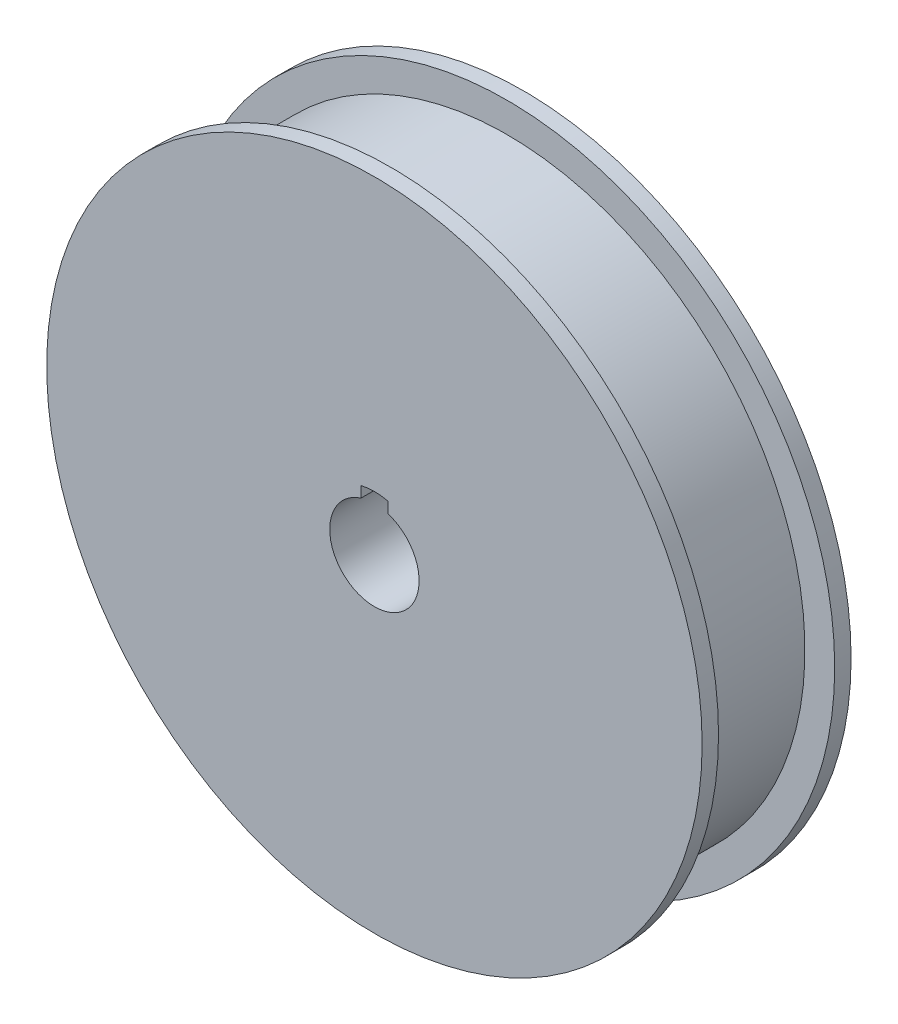
ISO-10303-21;
HEADER;
FILE_DESCRIPTION(('STEP AP214'),'2;1');
FILE_NAME('part.step','',(''),(''),'','','');
FILE_SCHEMA(('AUTOMOTIVE_DESIGN { 1 0 10303 214 1 1 1 1 }'));
ENDSEC;
DATA;
#1=APPLICATION_CONTEXT('core data for automotive mechanical design processes');
#2=APPLICATION_PROTOCOL_DEFINITION('international standard','automotive_design',2000,#1);
#3=PRODUCT_CONTEXT('',#1,'mechanical');
#4=PRODUCT('Part','Part','',(#3));
#5=PRODUCT_RELATED_PRODUCT_CATEGORY('part','',(#4));
#6=PRODUCT_DEFINITION_FORMATION('','',#4);
#7=PRODUCT_DEFINITION_CONTEXT('part definition',#1,'design');
#8=PRODUCT_DEFINITION('design','',#6,#7);
#9=PRODUCT_DEFINITION_SHAPE('','',#8);
#10=(LENGTH_UNIT() NAMED_UNIT(*) SI_UNIT(.MILLI.,.METRE.));
#11=(NAMED_UNIT(*) PLANE_ANGLE_UNIT() SI_UNIT($,.RADIAN.));
#12=(NAMED_UNIT(*) SI_UNIT($,.STERADIAN.) SOLID_ANGLE_UNIT());
#13=UNCERTAINTY_MEASURE_WITH_UNIT(LENGTH_MEASURE(1.E-05),#10,'distance_accuracy_value','');
#14=(GEOMETRIC_REPRESENTATION_CONTEXT(3) GLOBAL_UNCERTAINTY_ASSIGNED_CONTEXT((#13)) GLOBAL_UNIT_ASSIGNED_CONTEXT((#10,
#11,#12)) REPRESENTATION_CONTEXT('',''));
#15=CARTESIAN_POINT('',(0.,0.,0.));
#16=DIRECTION('',(0.,0.,1.));
#17=DIRECTION('',(1.,0.,0.));
#18=AXIS2_PLACEMENT_3D('',#15,#16,#17);
#19=CARTESIAN_POINT('',(0.,0.,50.));
#20=DIRECTION('',(0.,0.,-1.));
#21=DIRECTION('',(-1.,0.,0.));
#22=AXIS2_PLACEMENT_3D('',#19,#20,#21);
#23=CYLINDRICAL_SURFACE('',#22,200.);
#24=CARTESIAN_POINT('',(0.,0.,39.));
#25=DIRECTION('',(0.,0.,1.));
#26=DIRECTION('',(1.,0.,0.));
#27=AXIS2_PLACEMENT_3D('',#24,#25,#26);
#28=CIRCLE('',#27,200.);
#29=CARTESIAN_POINT('',(200.,0.,39.));
#30=VERTEX_POINT('',#29);
#31=EDGE_CURVE('E110',#30,#30,#28,.T.);
#32=ORIENTED_EDGE('',*,*,#31,.F.);
#33=EDGE_LOOP('',(#32));
#34=FACE_BOUND('',#33,.T.);
#35=CARTESIAN_POINT('',(0.,0.,-39.));
#36=DIRECTION('',(0.,0.,-1.));
#37=DIRECTION('',(-1.,0.,0.));
#38=AXIS2_PLACEMENT_3D('',#35,#36,#37);
#39=CIRCLE('',#38,200.);
#40=CARTESIAN_POINT('',(-200.,0.,-39.));
#41=VERTEX_POINT('',#40);
#42=EDGE_CURVE('E107',#41,#41,#39,.T.);
#43=ORIENTED_EDGE('',*,*,#42,.F.);
#44=EDGE_LOOP('',(#43));
#45=FACE_BOUND('',#44,.T.);
#46=ADVANCED_FACE('F33',(#34,#45),#23,.T.);
#47=CARTESIAN_POINT('',(0.,0.,50.));
#48=DIRECTION('',(0.,0.,1.));
#49=DIRECTION('',(1.,0.,0.));
#50=AXIS2_PLACEMENT_3D('',#47,#48,#49);
#51=PLANE('',#50);
#52=DIRECTION('',(0.,-1.,0.));
#53=VECTOR('',#52,1.);
#54=CARTESIAN_POINT('',(-9.,19.4566110905982,50.));
#55=LINE('',#54,#53);
#56=CARTESIAN_POINT('',(-9.,35.8887168898527,50.));
#57=VERTEX_POINT('',#56);
#58=CARTESIAN_POINT('',(-9.,28.6181760425084,50.));
#59=VERTEX_POINT('',#58);
#60=EDGE_CURVE('E91',#57,#59,#55,.T.);
#61=ORIENTED_EDGE('',*,*,#60,.F.);
#62=CARTESIAN_POINT('',(0.,0.,50.));
#63=DIRECTION('',(0.,0.,1.));
#64=DIRECTION('',(1.,0.,0.));
#65=AXIS2_PLACEMENT_3D('',#62,#63,#64);
#66=CIRCLE('',#65,37.);
#67=CARTESIAN_POINT('',(9.,35.8887168898527,50.));
#68=VERTEX_POINT('',#67);
#69=EDGE_CURVE('E93',#68,#57,#66,.T.);
#70=ORIENTED_EDGE('',*,*,#69,.F.);
#71=DIRECTION('',(0.,1.,0.));
#72=VECTOR('',#71,1.);
#73=CARTESIAN_POINT('',(9.,19.4566110905982,50.));
#74=LINE('',#73,#72);
#75=CARTESIAN_POINT('',(9.,28.6181760425084,50.));
#76=VERTEX_POINT('',#75);
#77=EDGE_CURVE('E74',#76,#68,#74,.T.);
#78=ORIENTED_EDGE('',*,*,#77,.F.);
#79=CARTESIAN_POINT('',(0.,0.,50.));
#80=DIRECTION('',(0.,0.,1.));
#81=DIRECTION('',(1.,0.,0.));
#82=AXIS2_PLACEMENT_3D('',#79,#80,#81);
#83=CIRCLE('',#82,30.);
#84=EDGE_CURVE('E118',#59,#76,#83,.T.);
#85=ORIENTED_EDGE('',*,*,#84,.F.);
#86=EDGE_LOOP('',(#61,#70,#78,#85));
#87=FACE_BOUND('',#86,.T.);
#88=CARTESIAN_POINT('',(0.,0.,50.));
#89=DIRECTION('',(0.,0.,1.));
#90=DIRECTION('',(1.,0.,0.));
#91=AXIS2_PLACEMENT_3D('',#88,#89,#90);
#92=CIRCLE('',#91,220.);
#93=CARTESIAN_POINT('',(220.,0.,50.));
#94=VERTEX_POINT('',#93);
#95=EDGE_CURVE('E104',#94,#94,#92,.T.);
#96=ORIENTED_EDGE('',*,*,#95,.T.);
#97=EDGE_LOOP('',(#96));
#98=FACE_BOUND('',#97,.T.);
#99=ADVANCED_FACE('F125',(#87,#98),#51,.T.);
#100=CARTESIAN_POINT('',(0.,0.,-50.));
#101=DIRECTION('',(0.,0.,1.));
#102=DIRECTION('',(1.,0.,0.));
#103=AXIS2_PLACEMENT_3D('',#100,#101,#102);
#104=PLANE('',#103);
#105=CARTESIAN_POINT('',(0.,0.,-50.));
#106=DIRECTION('',(0.,0.,1.));
#107=DIRECTION('',(1.,0.,0.));
#108=AXIS2_PLACEMENT_3D('',#105,#106,#107);
#109=CIRCLE('',#108,37.);
#110=CARTESIAN_POINT('',(9.,35.8887168898527,-50.));
#111=VERTEX_POINT('',#110);
#112=CARTESIAN_POINT('',(-9.,35.8887168898527,-50.));
#113=VERTEX_POINT('',#112);
#114=EDGE_CURVE('E82',#111,#113,#109,.T.);
#115=ORIENTED_EDGE('',*,*,#114,.T.);
#116=DIRECTION('',(0.,-1.,0.));
#117=VECTOR('',#116,1.);
#118=CARTESIAN_POINT('',(-9.,19.4566110905982,-50.));
#119=LINE('',#118,#117);
#120=CARTESIAN_POINT('',(-9.,28.6181760425084,-50.));
#121=VERTEX_POINT('',#120);
#122=EDGE_CURVE('E79',#113,#121,#119,.T.);
#123=ORIENTED_EDGE('',*,*,#122,.T.);
#124=CARTESIAN_POINT('',(0.,0.,-50.));
#125=DIRECTION('',(0.,0.,1.));
#126=DIRECTION('',(1.,0.,0.));
#127=AXIS2_PLACEMENT_3D('',#124,#125,#126);
#128=CIRCLE('',#127,30.);
#129=CARTESIAN_POINT('',(9.,28.6181760425084,-50.));
#130=VERTEX_POINT('',#129);
#131=EDGE_CURVE('E90',#121,#130,#128,.T.);
#132=ORIENTED_EDGE('',*,*,#131,.T.);
#133=DIRECTION('',(0.,1.,0.));
#134=VECTOR('',#133,1.);
#135=CARTESIAN_POINT('',(9.,19.4566110905982,-50.));
#136=LINE('',#135,#134);
#137=EDGE_CURVE('E47',#130,#111,#136,.T.);
#138=ORIENTED_EDGE('',*,*,#137,.T.);
#139=EDGE_LOOP('',(#115,#123,#132,#138));
#140=FACE_BOUND('',#139,.T.);
#141=CARTESIAN_POINT('',(0.,0.,-50.));
#142=DIRECTION('',(0.,0.,1.));
#143=DIRECTION('',(1.,0.,0.));
#144=AXIS2_PLACEMENT_3D('',#141,#142,#143);
#145=CIRCLE('',#144,220.);
#146=CARTESIAN_POINT('',(220.,0.,-50.));
#147=VERTEX_POINT('',#146);
#148=EDGE_CURVE('E99',#147,#147,#145,.T.);
#149=ORIENTED_EDGE('',*,*,#148,.F.);
#150=EDGE_LOOP('',(#149));
#151=FACE_BOUND('',#150,.T.);
#152=ADVANCED_FACE('F87',(#140,#151),#104,.F.);
#153=CARTESIAN_POINT('',(0.,0.,50.));
#154=DIRECTION('',(0.,0.,-1.));
#155=DIRECTION('',(-1.,0.,0.));
#156=AXIS2_PLACEMENT_3D('',#153,#154,#155);
#157=CYLINDRICAL_SURFACE('',#156,30.);
#158=DIRECTION('',(0.,0.,-1.));
#159=VECTOR('',#158,1.);
#160=CARTESIAN_POINT('',(-9.,28.6181760425084,50.));
#161=LINE('',#160,#159);
#162=EDGE_CURVE('E11',#59,#121,#161,.T.);
#163=ORIENTED_EDGE('',*,*,#162,.F.);
#164=ORIENTED_EDGE('',*,*,#84,.T.);
#165=DIRECTION('',(0.,0.,-1.));
#166=VECTOR('',#165,1.);
#167=CARTESIAN_POINT('',(9.,28.6181760425084,50.));
#168=LINE('',#167,#166);
#169=EDGE_CURVE('E40',#130,#76,#168,.F.);
#170=ORIENTED_EDGE('',*,*,#169,.F.);
#171=ORIENTED_EDGE('',*,*,#131,.F.);
#172=EDGE_LOOP('',(#163,#164,#170,#171));
#173=FACE_BOUND('',#172,.T.);
#174=ADVANCED_FACE('F127',(#173),#157,.F.);
#175=CARTESIAN_POINT('',(0.,0.,39.));
#176=DIRECTION('',(0.,0.,1.));
#177=DIRECTION('',(1.,0.,0.));
#178=AXIS2_PLACEMENT_3D('',#175,#176,#177);
#179=PLANE('',#178);
#180=CARTESIAN_POINT('',(0.,0.,39.));
#181=DIRECTION('',(0.,0.,1.));
#182=DIRECTION('',(1.,0.,0.));
#183=AXIS2_PLACEMENT_3D('',#180,#181,#182);
#184=CIRCLE('',#183,220.);
#185=CARTESIAN_POINT('',(220.,0.,39.));
#186=VERTEX_POINT('',#185);
#187=EDGE_CURVE('E111',#186,#186,#184,.T.);
#188=ORIENTED_EDGE('',*,*,#187,.F.);
#189=EDGE_LOOP('',(#188));
#190=FACE_BOUND('',#189,.T.);
#191=ORIENTED_EDGE('',*,*,#31,.T.);
#192=EDGE_LOOP('',(#191));
#193=FACE_BOUND('',#192,.T.);
#194=ADVANCED_FACE('F129',(#190,#193),#179,.F.);
#195=CARTESIAN_POINT('',(0.,0.,39.));
#196=DIRECTION('',(0.,0.,1.));
#197=DIRECTION('',(1.,0.,0.));
#198=AXIS2_PLACEMENT_3D('',#195,#196,#197);
#199=CYLINDRICAL_SURFACE('',#198,220.);
#200=ORIENTED_EDGE('',*,*,#187,.T.);
#201=EDGE_LOOP('',(#200));
#202=FACE_BOUND('',#201,.T.);
#203=ORIENTED_EDGE('',*,*,#95,.F.);
#204=EDGE_LOOP('',(#203));
#205=FACE_BOUND('',#204,.T.);
#206=ADVANCED_FACE('F135',(#202,#205),#199,.T.);
#207=CARTESIAN_POINT('',(0.,0.,-39.));
#208=DIRECTION('',(0.,0.,-1.));
#209=DIRECTION('',(1.,0.,0.));
#210=AXIS2_PLACEMENT_3D('',#207,#208,#209);
#211=PLANE('',#210);
#212=CARTESIAN_POINT('',(0.,0.,-39.));
#213=DIRECTION('',(0.,0.,1.));
#214=DIRECTION('',(1.,0.,0.));
#215=AXIS2_PLACEMENT_3D('',#212,#213,#214);
#216=CIRCLE('',#215,220.);
#217=CARTESIAN_POINT('',(220.,0.,-39.));
#218=VERTEX_POINT('',#217);
#219=EDGE_CURVE('E101',#218,#218,#216,.T.);
#220=ORIENTED_EDGE('',*,*,#219,.T.);
#221=EDGE_LOOP('',(#220));
#222=FACE_BOUND('',#221,.T.);
#223=ORIENTED_EDGE('',*,*,#42,.T.);
#224=EDGE_LOOP('',(#223));
#225=FACE_BOUND('',#224,.T.);
#226=ADVANCED_FACE('F149',(#222,#225),#211,.F.);
#227=CARTESIAN_POINT('',(0.,0.,-39.));
#228=DIRECTION('',(0.,0.,-1.));
#229=DIRECTION('',(-1.,0.,0.));
#230=AXIS2_PLACEMENT_3D('',#227,#228,#229);
#231=CYLINDRICAL_SURFACE('',#230,220.);
#232=ORIENTED_EDGE('',*,*,#219,.F.);
#233=EDGE_LOOP('',(#232));
#234=FACE_BOUND('',#233,.T.);
#235=ORIENTED_EDGE('',*,*,#148,.T.);
#236=EDGE_LOOP('',(#235));
#237=FACE_BOUND('',#236,.T.);
#238=ADVANCED_FACE('F151',(#234,#237),#231,.T.);
#239=CARTESIAN_POINT('',(-9.,19.4566110905982,-50.));
#240=DIRECTION('',(-1.,0.,0.));
#241=DIRECTION('',(0.,-1.,0.));
#242=AXIS2_PLACEMENT_3D('',#239,#240,#241);
#243=PLANE('',#242);
#244=ORIENTED_EDGE('',*,*,#162,.T.);
#245=ORIENTED_EDGE('',*,*,#122,.F.);
#246=DIRECTION('',(0.,0.,1.));
#247=VECTOR('',#246,1.);
#248=CARTESIAN_POINT('',(-9.,35.8887168898527,-50.));
#249=LINE('',#248,#247);
#250=EDGE_CURVE('E78',#113,#57,#249,.T.);
#251=ORIENTED_EDGE('',*,*,#250,.T.);
#252=ORIENTED_EDGE('',*,*,#60,.T.);
#253=EDGE_LOOP('',(#244,#245,#251,#252));
#254=FACE_BOUND('',#253,.T.);
#255=ADVANCED_FACE('F158',(#254),#243,.F.);
#256=CARTESIAN_POINT('',(0.,0.,-50.));
#257=DIRECTION('',(0.,0.,1.));
#258=DIRECTION('',(1.,0.,0.));
#259=AXIS2_PLACEMENT_3D('',#256,#257,#258);
#260=CYLINDRICAL_SURFACE('',#259,37.);
#261=ORIENTED_EDGE('',*,*,#69,.T.);
#262=ORIENTED_EDGE('',*,*,#250,.F.);
#263=ORIENTED_EDGE('',*,*,#114,.F.);
#264=DIRECTION('',(0.,0.,1.));
#265=VECTOR('',#264,1.);
#266=CARTESIAN_POINT('',(9.,35.8887168898527,-50.));
#267=LINE('',#266,#265);
#268=EDGE_CURVE('E70',#111,#68,#267,.T.);
#269=ORIENTED_EDGE('',*,*,#268,.T.);
#270=EDGE_LOOP('',(#261,#262,#263,#269));
#271=FACE_BOUND('',#270,.T.);
#272=ADVANCED_FACE('F83',(#271),#260,.F.);
#273=CARTESIAN_POINT('',(9.,19.4566110905982,-50.));
#274=DIRECTION('',(1.,0.,0.));
#275=DIRECTION('',(0.,1.,0.));
#276=AXIS2_PLACEMENT_3D('',#273,#274,#275);
#277=PLANE('',#276);
#278=ORIENTED_EDGE('',*,*,#169,.T.);
#279=ORIENTED_EDGE('',*,*,#77,.T.);
#280=ORIENTED_EDGE('',*,*,#268,.F.);
#281=ORIENTED_EDGE('',*,*,#137,.F.);
#282=EDGE_LOOP('',(#278,#279,#280,#281));
#283=FACE_BOUND('',#282,.T.);
#284=ADVANCED_FACE('F72',(#283),#277,.F.);
#285=CLOSED_SHELL('',(#46,#99,#152,#174,#194,#206,#226,#238,#255,#272,#284));
#286=MANIFOLD_SOLID_BREP('B2',#285);
#287=ADVANCED_BREP_SHAPE_REPRESENTATION('',(#18,#286),#14);
#288=SHAPE_DEFINITION_REPRESENTATION(#9,#287);
ENDSEC;
END-ISO-10303-21;
